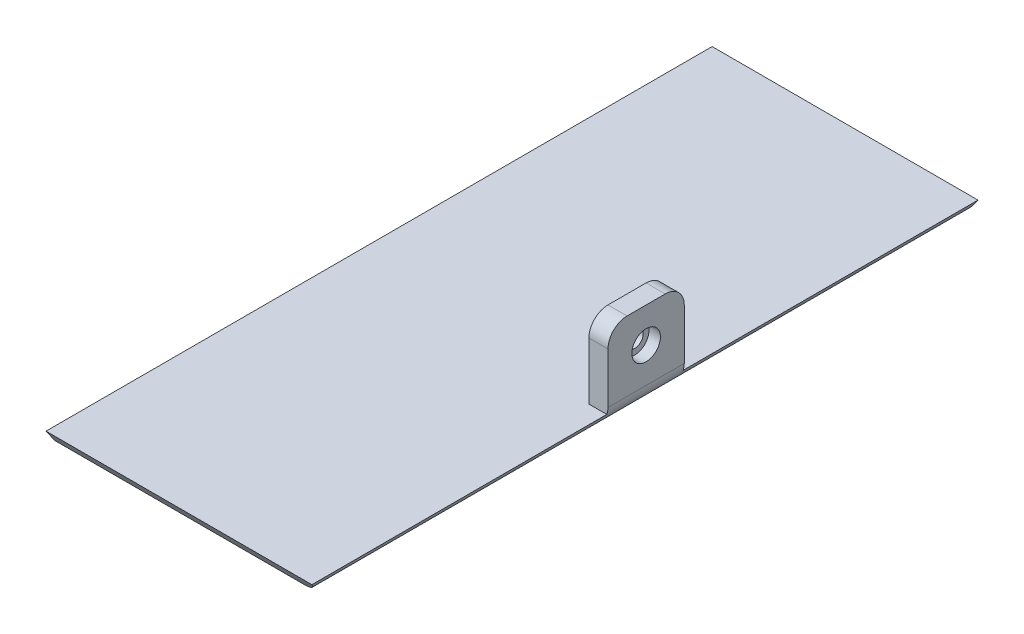
ISO-10303-21;
HEADER;
FILE_DESCRIPTION(('STEP AP214'),'2;1');
FILE_NAME('part.step','',(''),(''),'','','');
FILE_SCHEMA(('AUTOMOTIVE_DESIGN { 1 0 10303 214 1 1 1 1 }'));
ENDSEC;
DATA;
#1=APPLICATION_CONTEXT('core data for automotive mechanical design processes');
#2=APPLICATION_PROTOCOL_DEFINITION('international standard','automotive_design',2000,#1);
#3=PRODUCT_CONTEXT('',#1,'mechanical');
#4=PRODUCT('Part','Part','',(#3));
#5=PRODUCT_RELATED_PRODUCT_CATEGORY('part','',(#4));
#6=PRODUCT_DEFINITION_FORMATION('','',#4);
#7=PRODUCT_DEFINITION_CONTEXT('part definition',#1,'design');
#8=PRODUCT_DEFINITION('design','',#6,#7);
#9=PRODUCT_DEFINITION_SHAPE('','',#8);
#10=(LENGTH_UNIT() NAMED_UNIT(*) SI_UNIT(.MILLI.,.METRE.));
#11=(NAMED_UNIT(*) PLANE_ANGLE_UNIT() SI_UNIT($,.RADIAN.));
#12=(NAMED_UNIT(*) SI_UNIT($,.STERADIAN.) SOLID_ANGLE_UNIT());
#13=UNCERTAINTY_MEASURE_WITH_UNIT(LENGTH_MEASURE(1.E-05),#10,'distance_accuracy_value','');
#14=(GEOMETRIC_REPRESENTATION_CONTEXT(3) GLOBAL_UNCERTAINTY_ASSIGNED_CONTEXT((#13)) GLOBAL_UNIT_ASSIGNED_CONTEXT((#10,
#11,#12)) REPRESENTATION_CONTEXT('',''));
#15=CARTESIAN_POINT('',(0.,0.,0.));
#16=DIRECTION('',(0.,0.,1.));
#17=DIRECTION('',(1.,0.,0.));
#18=AXIS2_PLACEMENT_3D('',#15,#16,#17);
#19=CARTESIAN_POINT('',(-0.001000000000001,12.5,0.));
#20=DIRECTION('',(1.,0.,0.));
#21=DIRECTION('',(0.,0.,-1.));
#22=AXIS2_PLACEMENT_3D('',#19,#20,#21);
#23=CYLINDRICAL_SURFACE('',#22,2.25);
#24=CARTESIAN_POINT('',(64.9999999999999,12.5,0.));
#25=DIRECTION('',(1.,0.,0.));
#26=DIRECTION('',(0.,0.,-1.));
#27=AXIS2_PLACEMENT_3D('',#24,#25,#26);
#28=CIRCLE('',#27,2.25);
#29=CARTESIAN_POINT('',(64.9999999999999,12.5,-2.25));
#30=VERTEX_POINT('',#29);
#31=EDGE_CURVE('E136',#30,#30,#28,.F.);
#32=ORIENTED_EDGE('',*,*,#31,.T.);
#33=EDGE_LOOP('',(#32));
#34=FACE_BOUND('',#33,.T.);
#35=CARTESIAN_POINT('',(67.,12.5,0.));
#36=DIRECTION('',(1.,0.,0.));
#37=DIRECTION('',(0.,0.,-1.));
#38=AXIS2_PLACEMENT_3D('',#35,#36,#37);
#39=CIRCLE('',#38,2.25);
#40=CARTESIAN_POINT('',(67.,12.5,-2.25));
#41=VERTEX_POINT('',#40);
#42=EDGE_CURVE('E166',#41,#41,#39,.F.);
#43=ORIENTED_EDGE('',*,*,#42,.F.);
#44=EDGE_LOOP('',(#43));
#45=FACE_BOUND('',#44,.T.);
#46=ADVANCED_FACE('F44',(#34,#45),#23,.F.);
#47=CARTESIAN_POINT('',(70.,1.63830408857799,-87.2943057454042));
#48=DIRECTION('',(0.,-1.,0.));
#49=DIRECTION('',(0.,0.,-1.));
#50=AXIS2_PLACEMENT_3D('',#47,#48,#49);
#51=PLANE('',#50);
#52=DIRECTION('',(0.,0.,1.));
#53=VECTOR('',#52,1.);
#54=CARTESIAN_POINT('',(69.6936042254278,1.63830408857799,-87.2943057454042));
#55=LINE('',#54,#53);
#56=CARTESIAN_POINT('',(69.6936042254278,1.63830408857799,-87.2943057454042));
#57=VERTEX_POINT('',#56);
#58=CARTESIAN_POINT('',(69.6936042254278,1.63830408857799,-10.0000000000001));
#59=VERTEX_POINT('',#58);
#60=EDGE_CURVE('E151',#57,#59,#55,.T.);
#61=ORIENTED_EDGE('',*,*,#60,.F.);
#62=DIRECTION('',(-1.,0.,0.));
#63=VECTOR('',#62,1.);
#64=CARTESIAN_POINT('',(70.,1.63830408857799,-87.2943057454042));
#65=LINE('',#64,#63);
#66=CARTESIAN_POINT('',(0.,1.63830408857799,-87.2943057454042));
#67=VERTEX_POINT('',#66);
#68=EDGE_CURVE('E146',#57,#67,#65,.T.);
#69=ORIENTED_EDGE('',*,*,#68,.T.);
#70=DIRECTION('',(0.,0.,1.));
#71=VECTOR('',#70,1.);
#72=CARTESIAN_POINT('',(0.,1.63830408857799,-87.2943057454042));
#73=LINE('',#72,#71);
#74=CARTESIAN_POINT('',(0.,1.63830408857799,87.2943057454042));
#75=VERTEX_POINT('',#74);
#76=EDGE_CURVE('E237',#67,#75,#73,.T.);
#77=ORIENTED_EDGE('',*,*,#76,.T.);
#78=DIRECTION('',(-1.,0.,0.));
#79=VECTOR('',#78,1.);
#80=CARTESIAN_POINT('',(70.,1.63830408857799,87.2943057454042));
#81=LINE('',#80,#79);
#82=CARTESIAN_POINT('',(69.6936042254278,1.63830408857799,87.2943057454042));
#83=VERTEX_POINT('',#82);
#84=EDGE_CURVE('E164',#83,#75,#81,.T.);
#85=ORIENTED_EDGE('',*,*,#84,.F.);
#86=CARTESIAN_POINT('',(69.6936042254278,1.63830408857799,9.99999999999993));
#87=VERTEX_POINT('',#86);
#88=EDGE_CURVE('E314',#87,#83,#55,.T.);
#89=ORIENTED_EDGE('',*,*,#88,.F.);
#90=DIRECTION('',(1.,0.,0.));
#91=VECTOR('',#90,1.);
#92=CARTESIAN_POINT('',(64.9999999999999,1.63830408857799,9.99999999999993));
#93=LINE('',#92,#91);
#94=CARTESIAN_POINT('',(64.9999999999999,1.63830408857799,9.99999999999993));
#95=VERTEX_POINT('',#94);
#96=EDGE_CURVE('E322',#95,#87,#93,.T.);
#97=ORIENTED_EDGE('',*,*,#96,.F.);
#98=DIRECTION('',(0.,0.,1.));
#99=VECTOR('',#98,1.);
#100=CARTESIAN_POINT('',(64.9999999999999,1.63830408857799,9.99999999999993));
#101=LINE('',#100,#99);
#102=CARTESIAN_POINT('',(64.9999999999999,1.63830408857799,-10.0000000000001));
#103=VERTEX_POINT('',#102);
#104=EDGE_CURVE('E319',#103,#95,#101,.T.);
#105=ORIENTED_EDGE('',*,*,#104,.F.);
#106=DIRECTION('',(-1.,0.,0.));
#107=VECTOR('',#106,1.);
#108=CARTESIAN_POINT('',(64.9999999999999,1.63830408857799,-10.0000000000001));
#109=LINE('',#108,#107);
#110=EDGE_CURVE('E216',#59,#103,#109,.T.);
#111=ORIENTED_EDGE('',*,*,#110,.F.);
#112=EDGE_LOOP('',(#61,#69,#77,#85,#89,#97,#105,#111));
#113=FACE_BOUND('',#112,.T.);
#114=ADVANCED_FACE('F255',(#113),#51,.F.);
#115=CARTESIAN_POINT('',(70.,-1.63830408857799,-85.));
#116=DIRECTION('',(0.,0.573576436351049,0.819152044288989));
#117=DIRECTION('',(0.,-0.819152044288989,0.573576436351049));
#118=AXIS2_PLACEMENT_3D('',#115,#116,#117);
#119=PLANE('',#118);
#120=CARTESIAN_POINT('',(64.9999999999999,3.36169591142201,-88.5010376910485));
#121=DIRECTION('',(0.,0.573576436351049,0.819152044288989));
#122=DIRECTION('',(0.,-0.819152044288989,0.573576436351049));
#123=AXIS2_PLACEMENT_3D('',#120,#121,#122);
#124=ELLIPSE('',#123,6.10387294380734,5.00000000000003);
#125=CARTESIAN_POINT('',(64.9999999999999,-1.63830408857799,-85.));
#126=VERTEX_POINT('',#125);
#127=EDGE_CURVE('E132',#126,#57,#124,.T.);
#128=ORIENTED_EDGE('',*,*,#127,.F.);
#129=DIRECTION('',(-1.,0.,0.));
#130=VECTOR('',#129,1.);
#131=CARTESIAN_POINT('',(70.,-1.63830408857799,-85.));
#132=LINE('',#131,#130);
#133=CARTESIAN_POINT('',(0.,-1.63830408857799,-85.));
#134=VERTEX_POINT('',#133);
#135=EDGE_CURVE('E148',#126,#134,#132,.T.);
#136=ORIENTED_EDGE('',*,*,#135,.T.);
#137=DIRECTION('',(0.,0.819152044288989,-0.573576436351049));
#138=VECTOR('',#137,1.);
#139=CARTESIAN_POINT('',(0.,-1.63830408857799,-85.));
#140=LINE('',#139,#138);
#141=EDGE_CURVE('E232',#134,#67,#140,.T.);
#142=ORIENTED_EDGE('',*,*,#141,.T.);
#143=ORIENTED_EDGE('',*,*,#68,.F.);
#144=EDGE_LOOP('',(#128,#136,#142,#143));
#145=FACE_BOUND('',#144,.T.);
#146=ADVANCED_FACE('F145',(#145),#119,.F.);
#147=CARTESIAN_POINT('',(70.,-1.63830408857799,85.));
#148=DIRECTION('',(0.,0.573576436351049,-0.819152044288989));
#149=DIRECTION('',(0.,0.819152044288989,0.573576436351049));
#150=AXIS2_PLACEMENT_3D('',#147,#148,#149);
#151=PLANE('',#150);
#152=CARTESIAN_POINT('',(64.9999999999999,3.36169591142201,88.5010376910485));
#153=DIRECTION('',(0.,0.573576436351049,-0.819152044288989));
#154=DIRECTION('',(0.,0.819152044288989,0.573576436351049));
#155=AXIS2_PLACEMENT_3D('',#152,#153,#154);
#156=ELLIPSE('',#155,6.10387294380734,5.00000000000003);
#157=CARTESIAN_POINT('',(64.9999999999999,-1.63830408857799,85.));
#158=VERTEX_POINT('',#157);
#159=EDGE_CURVE('E131',#83,#158,#156,.T.);
#160=ORIENTED_EDGE('',*,*,#159,.F.);
#161=ORIENTED_EDGE('',*,*,#84,.T.);
#162=DIRECTION('',(0.,-0.819152044288989,-0.573576436351049));
#163=VECTOR('',#162,1.);
#164=CARTESIAN_POINT('',(0.,-1.63830408857799,85.));
#165=LINE('',#164,#163);
#166=CARTESIAN_POINT('',(0.,-1.63830408857799,85.));
#167=VERTEX_POINT('',#166);
#168=EDGE_CURVE('E238',#75,#167,#165,.T.);
#169=ORIENTED_EDGE('',*,*,#168,.T.);
#170=DIRECTION('',(-1.,0.,0.));
#171=VECTOR('',#170,1.);
#172=CARTESIAN_POINT('',(70.,-1.63830408857799,85.));
#173=LINE('',#172,#171);
#174=EDGE_CURVE('E241',#158,#167,#173,.T.);
#175=ORIENTED_EDGE('',*,*,#174,.F.);
#176=EDGE_LOOP('',(#160,#161,#169,#175));
#177=FACE_BOUND('',#176,.T.);
#178=ADVANCED_FACE('F250',(#177),#151,.F.);
#179=CARTESIAN_POINT('',(70.,0.,0.));
#180=DIRECTION('',(-1.,0.,0.));
#181=DIRECTION('',(0.,0.,1.));
#182=AXIS2_PLACEMENT_3D('',#179,#180,#181);
#183=PLANE('',#182);
#184=CARTESIAN_POINT('',(70.,12.5,0.));
#185=DIRECTION('',(1.,0.,0.));
#186=DIRECTION('',(0.,0.,-1.));
#187=AXIS2_PLACEMENT_3D('',#184,#185,#186);
#188=CIRCLE('',#187,3.74999999999999);
#189=CARTESIAN_POINT('',(70.,12.5,-3.74999999999999));
#190=VERTEX_POINT('',#189);
#191=EDGE_CURVE('E298',#190,#190,#188,.T.);
#192=ORIENTED_EDGE('',*,*,#191,.F.);
#193=EDGE_LOOP('',(#192));
#194=FACE_BOUND('',#193,.T.);
#195=DIRECTION('',(0.,-1.,0.));
#196=VECTOR('',#195,1.);
#197=CARTESIAN_POINT('',(70.,21.638304088578,-10.0000000000001));
#198=LINE('',#197,#196);
#199=CARTESIAN_POINT('',(70.,16.638304088578,-10.0000000000001));
#200=VERTEX_POINT('',#199);
#201=CARTESIAN_POINT('',(70.,3.36169591142201,-10.0000000000001));
#202=VERTEX_POINT('',#201);
#203=EDGE_CURVE('E198',#200,#202,#198,.T.);
#204=ORIENTED_EDGE('',*,*,#203,.F.);
#205=CARTESIAN_POINT('',(70.,16.638304088578,-5.00000000000006));
#206=DIRECTION('',(-1.,0.,0.));
#207=DIRECTION('',(0.,0.,1.));
#208=AXIS2_PLACEMENT_3D('',#205,#206,#207);
#209=CIRCLE('',#208,5.);
#210=CARTESIAN_POINT('',(70.,21.638304088578,-5.00000000000006));
#211=VERTEX_POINT('',#210);
#212=EDGE_CURVE('E53',#200,#211,#209,.F.);
#213=ORIENTED_EDGE('',*,*,#212,.T.);
#214=DIRECTION('',(0.,0.,-1.));
#215=VECTOR('',#214,1.);
#216=CARTESIAN_POINT('',(70.,21.638304088578,9.99999999999993));
#217=LINE('',#216,#215);
#218=CARTESIAN_POINT('',(70.,21.638304088578,4.99999999999993));
#219=VERTEX_POINT('',#218);
#220=EDGE_CURVE('E195',#219,#211,#217,.T.);
#221=ORIENTED_EDGE('',*,*,#220,.F.);
#222=CARTESIAN_POINT('',(70.,16.638304088578,4.99999999999993));
#223=DIRECTION('',(-1.,0.,0.));
#224=DIRECTION('',(0.,0.,1.));
#225=AXIS2_PLACEMENT_3D('',#222,#223,#224);
#226=CIRCLE('',#225,5.);
#227=CARTESIAN_POINT('',(70.,16.638304088578,9.99999999999993));
#228=VERTEX_POINT('',#227);
#229=EDGE_CURVE('E62',#219,#228,#226,.F.);
#230=ORIENTED_EDGE('',*,*,#229,.T.);
#231=DIRECTION('',(0.,-1.,0.));
#232=VECTOR('',#231,1.);
#233=CARTESIAN_POINT('',(70.,21.638304088578,9.99999999999993));
#234=LINE('',#233,#232);
#235=CARTESIAN_POINT('',(70.,3.36169591142201,9.99999999999993));
#236=VERTEX_POINT('',#235);
#237=EDGE_CURVE('E222',#228,#236,#234,.T.);
#238=ORIENTED_EDGE('',*,*,#237,.T.);
#239=DIRECTION('',(0.,0.,1.));
#240=VECTOR('',#239,1.);
#241=CARTESIAN_POINT('',(70.,3.36169591142201,-87.2943057454042));
#242=LINE('',#241,#240);
#243=EDGE_CURVE('E140',#202,#236,#242,.T.);
#244=ORIENTED_EDGE('',*,*,#243,.F.);
#245=EDGE_LOOP('',(#204,#213,#221,#230,#238,#244));
#246=FACE_BOUND('',#245,.T.);
#247=ADVANCED_FACE('F192',(#194,#246),#183,.F.);
#248=CARTESIAN_POINT('',(64.9999999999999,21.638304088578,9.99999999999993));
#249=DIRECTION('',(0.,0.,-1.));
#250=DIRECTION('',(-1.,0.,0.));
#251=AXIS2_PLACEMENT_3D('',#248,#249,#250);
#252=PLANE('',#251);
#253=ORIENTED_EDGE('',*,*,#237,.F.);
#254=DIRECTION('',(1.,0.,0.));
#255=VECTOR('',#254,1.);
#256=CARTESIAN_POINT('',(64.9999999999999,16.638304088578,9.99999999999993));
#257=LINE('',#256,#255);
#258=CARTESIAN_POINT('',(64.9999999999999,16.638304088578,9.99999999999993));
#259=VERTEX_POINT('',#258);
#260=EDGE_CURVE('E11',#228,#259,#257,.F.);
#261=ORIENTED_EDGE('',*,*,#260,.T.);
#262=DIRECTION('',(0.,-1.,0.));
#263=VECTOR('',#262,1.);
#264=CARTESIAN_POINT('',(64.9999999999999,21.638304088578,9.99999999999993));
#265=LINE('',#264,#263);
#266=EDGE_CURVE('E230',#259,#95,#265,.T.);
#267=ORIENTED_EDGE('',*,*,#266,.T.);
#268=ORIENTED_EDGE('',*,*,#96,.T.);
#269=CARTESIAN_POINT('',(64.9999999999999,3.36169591142201,9.99999999999993));
#270=DIRECTION('',(0.,0.,-1.));
#271=DIRECTION('',(-1.,0.,0.));
#272=AXIS2_PLACEMENT_3D('',#269,#270,#271);
#273=CIRCLE('',#272,5.00000000000003);
#274=EDGE_CURVE('E147',#236,#87,#273,.T.);
#275=ORIENTED_EDGE('',*,*,#274,.F.);
#276=EDGE_LOOP('',(#253,#261,#267,#268,#275));
#277=FACE_BOUND('',#276,.T.);
#278=ADVANCED_FACE('F290',(#277),#252,.F.);
#279=CARTESIAN_POINT('',(64.9999999999999,21.638304088578,-10.0000000000001));
#280=DIRECTION('',(0.,0.,1.));
#281=DIRECTION('',(1.,0.,0.));
#282=AXIS2_PLACEMENT_3D('',#279,#280,#281);
#283=PLANE('',#282);
#284=DIRECTION('',(0.,-1.,0.));
#285=VECTOR('',#284,1.);
#286=CARTESIAN_POINT('',(64.9999999999999,21.638304088578,-10.0000000000001));
#287=LINE('',#286,#285);
#288=CARTESIAN_POINT('',(64.9999999999999,16.638304088578,-10.0000000000001));
#289=VERTEX_POINT('',#288);
#290=EDGE_CURVE('E202',#289,#103,#287,.T.);
#291=ORIENTED_EDGE('',*,*,#290,.F.);
#292=DIRECTION('',(-1.,0.,0.));
#293=VECTOR('',#292,1.);
#294=CARTESIAN_POINT('',(64.9999999999999,16.638304088578,-10.0000000000001));
#295=LINE('',#294,#293);
#296=EDGE_CURVE('E70',#289,#200,#295,.F.);
#297=ORIENTED_EDGE('',*,*,#296,.T.);
#298=ORIENTED_EDGE('',*,*,#203,.T.);
#299=CARTESIAN_POINT('',(64.9999999999999,3.36169591142201,-10.0000000000001));
#300=DIRECTION('',(0.,0.,1.));
#301=DIRECTION('',(1.,0.,0.));
#302=AXIS2_PLACEMENT_3D('',#299,#300,#301);
#303=CIRCLE('',#302,5.00000000000003);
#304=EDGE_CURVE('E158',#59,#202,#303,.T.);
#305=ORIENTED_EDGE('',*,*,#304,.F.);
#306=ORIENTED_EDGE('',*,*,#110,.T.);
#307=EDGE_LOOP('',(#291,#297,#298,#305,#306));
#308=FACE_BOUND('',#307,.T.);
#309=ADVANCED_FACE('F213',(#308),#283,.F.);
#310=CARTESIAN_POINT('',(70.,-1.63830408857799,-85.));
#311=DIRECTION('',(0.,1.,0.));
#312=DIRECTION('',(0.,0.,1.));
#313=AXIS2_PLACEMENT_3D('',#310,#311,#312);
#314=PLANE('',#313);
#315=ORIENTED_EDGE('',*,*,#135,.F.);
#316=DIRECTION('',(0.,0.,1.));
#317=VECTOR('',#316,1.);
#318=CARTESIAN_POINT('',(64.9999999999999,-1.63830408857799,-87.2943057454042));
#319=LINE('',#318,#317);
#320=EDGE_CURVE('E126',#126,#158,#319,.T.);
#321=ORIENTED_EDGE('',*,*,#320,.T.);
#322=ORIENTED_EDGE('',*,*,#174,.T.);
#323=DIRECTION('',(0.,0.,-1.));
#324=VECTOR('',#323,1.);
#325=CARTESIAN_POINT('',(0.,-1.63830408857799,-85.));
#326=LINE('',#325,#324);
#327=EDGE_CURVE('E156',#167,#134,#326,.T.);
#328=ORIENTED_EDGE('',*,*,#327,.T.);
#329=EDGE_LOOP('',(#315,#321,#322,#328));
#330=FACE_BOUND('',#329,.T.);
#331=ADVANCED_FACE('F152',(#330),#314,.F.);
#332=CARTESIAN_POINT('',(0.,0.,0.));
#333=DIRECTION('',(-1.,0.,0.));
#334=DIRECTION('',(0.,0.,1.));
#335=AXIS2_PLACEMENT_3D('',#332,#333,#334);
#336=PLANE('',#335);
#337=ORIENTED_EDGE('',*,*,#327,.F.);
#338=ORIENTED_EDGE('',*,*,#168,.F.);
#339=ORIENTED_EDGE('',*,*,#76,.F.);
#340=ORIENTED_EDGE('',*,*,#141,.F.);
#341=EDGE_LOOP('',(#337,#338,#339,#340));
#342=FACE_BOUND('',#341,.T.);
#343=ADVANCED_FACE('F258',(#342),#336,.T.);
#344=CARTESIAN_POINT('',(64.9999999999999,21.638304088578,9.99999999999993));
#345=DIRECTION('',(1.,0.,0.));
#346=DIRECTION('',(0.,0.,-1.));
#347=AXIS2_PLACEMENT_3D('',#344,#345,#346);
#348=PLANE('',#347);
#349=ORIENTED_EDGE('',*,*,#31,.F.);
#350=EDGE_LOOP('',(#349));
#351=FACE_BOUND('',#350,.T.);
#352=DIRECTION('',(0.,0.,1.));
#353=VECTOR('',#352,1.);
#354=CARTESIAN_POINT('',(64.9999999999999,21.638304088578,9.99999999999993));
#355=LINE('',#354,#353);
#356=CARTESIAN_POINT('',(64.9999999999999,21.638304088578,-5.00000000000006));
#357=VERTEX_POINT('',#356);
#358=CARTESIAN_POINT('',(64.9999999999999,21.638304088578,4.99999999999993));
#359=VERTEX_POINT('',#358);
#360=EDGE_CURVE('E206',#357,#359,#355,.T.);
#361=ORIENTED_EDGE('',*,*,#360,.F.);
#362=CARTESIAN_POINT('',(64.9999999999999,16.638304088578,-5.00000000000006));
#363=DIRECTION('',(1.,0.,0.));
#364=DIRECTION('',(0.,0.,-1.));
#365=AXIS2_PLACEMENT_3D('',#362,#363,#364);
#366=CIRCLE('',#365,5.);
#367=EDGE_CURVE('E184',#357,#289,#366,.F.);
#368=ORIENTED_EDGE('',*,*,#367,.T.);
#369=ORIENTED_EDGE('',*,*,#290,.T.);
#370=ORIENTED_EDGE('',*,*,#104,.T.);
#371=ORIENTED_EDGE('',*,*,#266,.F.);
#372=CARTESIAN_POINT('',(64.9999999999999,16.638304088578,4.99999999999993));
#373=DIRECTION('',(1.,0.,0.));
#374=DIRECTION('',(0.,0.,-1.));
#375=AXIS2_PLACEMENT_3D('',#372,#373,#374);
#376=CIRCLE('',#375,5.);
#377=EDGE_CURVE('E182',#259,#359,#376,.F.);
#378=ORIENTED_EDGE('',*,*,#377,.T.);
#379=EDGE_LOOP('',(#361,#368,#369,#370,#371,#378));
#380=FACE_BOUND('',#379,.T.);
#381=ADVANCED_FACE('F209',(#351,#380),#348,.F.);
#382=CARTESIAN_POINT('',(0.,21.638304088578,0.));
#383=DIRECTION('',(0.,-1.,0.));
#384=DIRECTION('',(0.,0.,-1.));
#385=AXIS2_PLACEMENT_3D('',#382,#383,#384);
#386=PLANE('',#385);
#387=ORIENTED_EDGE('',*,*,#220,.T.);
#388=DIRECTION('',(-1.,0.,0.));
#389=VECTOR('',#388,1.);
#390=CARTESIAN_POINT('',(0.,21.638304088578,-5.00000000000006));
#391=LINE('',#390,#389);
#392=EDGE_CURVE('E179',#211,#357,#391,.T.);
#393=ORIENTED_EDGE('',*,*,#392,.T.);
#394=ORIENTED_EDGE('',*,*,#360,.T.);
#395=DIRECTION('',(1.,0.,0.));
#396=VECTOR('',#395,1.);
#397=CARTESIAN_POINT('',(0.,21.638304088578,4.99999999999993));
#398=LINE('',#397,#396);
#399=EDGE_CURVE('E162',#359,#219,#398,.T.);
#400=ORIENTED_EDGE('',*,*,#399,.T.);
#401=EDGE_LOOP('',(#387,#393,#394,#400));
#402=FACE_BOUND('',#401,.T.);
#403=ADVANCED_FACE('F199',(#402),#386,.F.);
#404=CARTESIAN_POINT('',(64.9999999999999,3.36169591142201,-87.2943057454042));
#405=DIRECTION('',(0.,0.,1.));
#406=DIRECTION('',(1.,0.,0.));
#407=AXIS2_PLACEMENT_3D('',#404,#405,#406);
#408=CYLINDRICAL_SURFACE('',#407,5.00000000000003);
#409=ORIENTED_EDGE('',*,*,#159,.T.);
#410=ORIENTED_EDGE('',*,*,#320,.F.);
#411=ORIENTED_EDGE('',*,*,#127,.T.);
#412=ORIENTED_EDGE('',*,*,#60,.T.);
#413=ORIENTED_EDGE('',*,*,#304,.T.);
#414=ORIENTED_EDGE('',*,*,#243,.T.);
#415=ORIENTED_EDGE('',*,*,#274,.T.);
#416=ORIENTED_EDGE('',*,*,#88,.T.);
#417=EDGE_LOOP('',(#409,#410,#411,#412,#413,#414,#415,#416));
#418=FACE_BOUND('',#417,.T.);
#419=ADVANCED_FACE('F128',(#418),#408,.T.);
#420=CARTESIAN_POINT('',(67.,12.5,0.));
#421=DIRECTION('',(1.,0.,0.));
#422=DIRECTION('',(0.,0.,-1.));
#423=AXIS2_PLACEMENT_3D('',#420,#421,#422);
#424=PLANE('',#423);
#425=CARTESIAN_POINT('',(67.,12.5,0.));
#426=DIRECTION('',(1.,0.,0.));
#427=DIRECTION('',(0.,0.,-1.));
#428=AXIS2_PLACEMENT_3D('',#425,#426,#427);
#429=CIRCLE('',#428,3.74999999999999);
#430=CARTESIAN_POINT('',(67.,12.5,-3.74999999999999));
#431=VERTEX_POINT('',#430);
#432=EDGE_CURVE('E175',#431,#431,#429,.T.);
#433=ORIENTED_EDGE('',*,*,#432,.T.);
#434=EDGE_LOOP('',(#433));
#435=FACE_BOUND('',#434,.T.);
#436=ORIENTED_EDGE('',*,*,#42,.T.);
#437=EDGE_LOOP('',(#436));
#438=FACE_BOUND('',#437,.T.);
#439=ADVANCED_FACE('F281',(#435,#438),#424,.T.);
#440=CARTESIAN_POINT('',(67.,12.5,0.));
#441=DIRECTION('',(1.,0.,0.));
#442=DIRECTION('',(0.,0.,-1.));
#443=AXIS2_PLACEMENT_3D('',#440,#441,#442);
#444=CYLINDRICAL_SURFACE('',#443,3.74999999999999);
#445=ORIENTED_EDGE('',*,*,#432,.F.);
#446=EDGE_LOOP('',(#445));
#447=FACE_BOUND('',#446,.T.);
#448=ORIENTED_EDGE('',*,*,#191,.T.);
#449=EDGE_LOOP('',(#448));
#450=FACE_BOUND('',#449,.T.);
#451=ADVANCED_FACE('F282',(#447,#450),#444,.F.);
#452=CARTESIAN_POINT('',(0.,16.638304088578,-5.00000000000006));
#453=DIRECTION('',(-1.,0.,0.));
#454=DIRECTION('',(0.,0.,1.));
#455=AXIS2_PLACEMENT_3D('',#452,#453,#454);
#456=CYLINDRICAL_SURFACE('',#455,5.);
#457=ORIENTED_EDGE('',*,*,#212,.F.);
#458=ORIENTED_EDGE('',*,*,#296,.F.);
#459=ORIENTED_EDGE('',*,*,#367,.F.);
#460=ORIENTED_EDGE('',*,*,#392,.F.);
#461=EDGE_LOOP('',(#457,#458,#459,#460));
#462=FACE_BOUND('',#461,.T.);
#463=ADVANCED_FACE('F208',(#462),#456,.T.);
#464=CARTESIAN_POINT('',(0.,16.638304088578,4.99999999999993));
#465=DIRECTION('',(1.,0.,0.));
#466=DIRECTION('',(0.,0.,-1.));
#467=AXIS2_PLACEMENT_3D('',#464,#465,#466);
#468=CYLINDRICAL_SURFACE('',#467,5.);
#469=ORIENTED_EDGE('',*,*,#377,.F.);
#470=ORIENTED_EDGE('',*,*,#260,.F.);
#471=ORIENTED_EDGE('',*,*,#229,.F.);
#472=ORIENTED_EDGE('',*,*,#399,.F.);
#473=EDGE_LOOP('',(#469,#470,#471,#472));
#474=FACE_BOUND('',#473,.T.);
#475=ADVANCED_FACE('F50',(#474),#468,.T.);
#476=CLOSED_SHELL('',(#46,#114,#146,#178,#247,#278,#309,#331,#343,#381,#403,#419,#439,#451,#463,#475));
#477=MANIFOLD_SOLID_BREP('B2',#476);
#478=ADVANCED_BREP_SHAPE_REPRESENTATION('',(#18,#477),#14);
#479=SHAPE_DEFINITION_REPRESENTATION(#9,#478);
ENDSEC;
END-ISO-10303-21;
